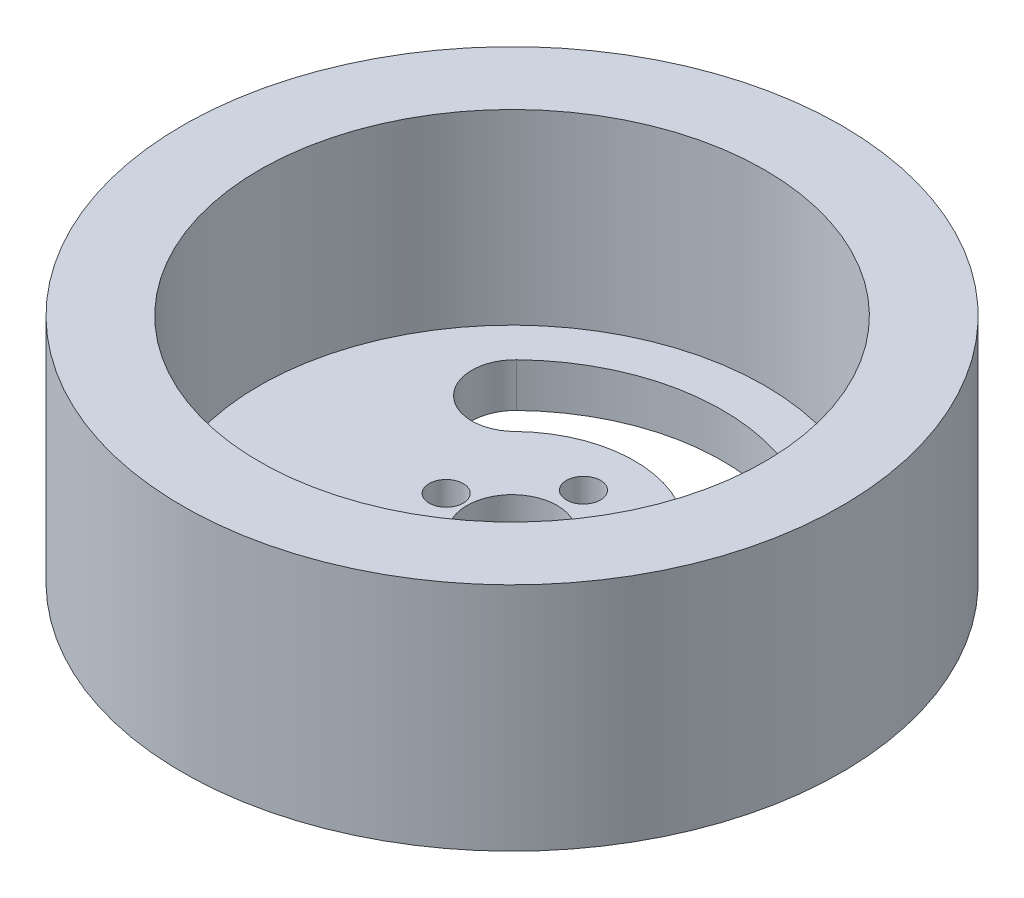
ISO-10303-21;
HEADER;
FILE_DESCRIPTION(('STEP AP214'),'2;1');
FILE_NAME('part.step','',(''),(''),'','','');
FILE_SCHEMA(('AUTOMOTIVE_DESIGN { 1 0 10303 214 1 1 1 1 }'));
ENDSEC;
DATA;
#1=APPLICATION_CONTEXT('core data for automotive mechanical design processes');
#2=APPLICATION_PROTOCOL_DEFINITION('international standard','automotive_design',2000,#1);
#3=PRODUCT_CONTEXT('',#1,'mechanical');
#4=PRODUCT('Part','Part','',(#3));
#5=PRODUCT_RELATED_PRODUCT_CATEGORY('part','',(#4));
#6=PRODUCT_DEFINITION_FORMATION('','',#4);
#7=PRODUCT_DEFINITION_CONTEXT('part definition',#1,'design');
#8=PRODUCT_DEFINITION('design','',#6,#7);
#9=PRODUCT_DEFINITION_SHAPE('','',#8);
#10=(LENGTH_UNIT() NAMED_UNIT(*) SI_UNIT(.MILLI.,.METRE.));
#11=(NAMED_UNIT(*) PLANE_ANGLE_UNIT() SI_UNIT($,.RADIAN.));
#12=(NAMED_UNIT(*) SI_UNIT($,.STERADIAN.) SOLID_ANGLE_UNIT());
#13=UNCERTAINTY_MEASURE_WITH_UNIT(LENGTH_MEASURE(1.E-05),#10,'distance_accuracy_value','');
#14=(GEOMETRIC_REPRESENTATION_CONTEXT(3) GLOBAL_UNCERTAINTY_ASSIGNED_CONTEXT((#13)) GLOBAL_UNIT_ASSIGNED_CONTEXT((#10,
#11,#12)) REPRESENTATION_CONTEXT('',''));
#15=CARTESIAN_POINT('',(0.,0.,0.));
#16=DIRECTION('',(0.,0.,1.));
#17=DIRECTION('',(1.,0.,0.));
#18=AXIS2_PLACEMENT_3D('',#15,#16,#17);
#19=CARTESIAN_POINT('',(0.,21.,0.));
#20=DIRECTION('',(0.,-1.,0.));
#21=DIRECTION('',(0.,0.,-1.));
#22=AXIS2_PLACEMENT_3D('',#19,#20,#21);
#23=CYLINDRICAL_SURFACE('',#22,23.);
#24=CARTESIAN_POINT('',(0.,21.,0.));
#25=DIRECTION('',(0.,1.,0.));
#26=DIRECTION('',(0.,0.,1.));
#27=AXIS2_PLACEMENT_3D('',#24,#25,#26);
#28=CIRCLE('',#27,23.);
#29=CARTESIAN_POINT('',(0.,21.,-23.));
#30=VERTEX_POINT('',#29);
#31=EDGE_CURVE('E178',#30,#30,#28,.T.);
#32=CARTESIAN_POINT('',(0.,4.,0.));
#33=DIRECTION('',(0.,-1.,0.));
#34=DIRECTION('',(0.,0.,-1.));
#35=AXIS2_PLACEMENT_3D('',#32,#33,#34);
#36=CIRCLE('',#35,23.);
#37=CARTESIAN_POINT('',(0.,4.,-23.));
#38=VERTEX_POINT('',#37);
#39=EDGE_CURVE('E169',#38,#38,#36,.T.);
#40=CARTESIAN_POINT('',(0.,21.,-23.));
#41=CARTESIAN_POINT('',(0.,20.8229166666667,-23.));
#42=CARTESIAN_POINT('',(0.,20.6458333333333,-23.));
#43=CARTESIAN_POINT('',(0.,20.2916666666667,-23.));
#44=CARTESIAN_POINT('',(0.,20.1145833333333,-23.));
#45=CARTESIAN_POINT('',(0.,19.7604166666667,-23.));
#46=CARTESIAN_POINT('',(0.,19.5833333333333,-23.));
#47=CARTESIAN_POINT('',(0.,19.2291666666667,-23.));
#48=CARTESIAN_POINT('',(0.,19.0520833333333,-23.));
#49=CARTESIAN_POINT('',(0.,18.6979166666667,-23.));
#50=CARTESIAN_POINT('',(0.,18.5208333333333,-23.));
#51=CARTESIAN_POINT('',(0.,18.1666666666667,-23.));
#52=CARTESIAN_POINT('',(0.,17.9895833333333,-23.));
#53=CARTESIAN_POINT('',(0.,17.6354166666667,-23.));
#54=CARTESIAN_POINT('',(0.,17.4583333333333,-23.));
#55=CARTESIAN_POINT('',(0.,17.1041666666667,-23.));
#56=CARTESIAN_POINT('',(0.,16.9270833333333,-23.));
#57=CARTESIAN_POINT('',(0.,16.5729166666667,-23.));
#58=CARTESIAN_POINT('',(0.,16.3958333333333,-23.));
#59=CARTESIAN_POINT('',(0.,16.0416666666667,-23.));
#60=CARTESIAN_POINT('',(0.,15.8645833333333,-23.));
#61=CARTESIAN_POINT('',(0.,15.5104166666667,-23.));
#62=CARTESIAN_POINT('',(0.,15.3333333333333,-23.));
#63=CARTESIAN_POINT('',(0.,14.9791666666667,-23.));
#64=CARTESIAN_POINT('',(0.,14.8020833333333,-23.));
#65=CARTESIAN_POINT('',(0.,14.4479166666667,-23.));
#66=CARTESIAN_POINT('',(0.,14.2708333333333,-23.));
#67=CARTESIAN_POINT('',(0.,13.9166666666667,-23.));
#68=CARTESIAN_POINT('',(0.,13.7395833333333,-23.));
#69=CARTESIAN_POINT('',(0.,13.3854166666667,-23.));
#70=CARTESIAN_POINT('',(0.,13.2083333333333,-23.));
#71=CARTESIAN_POINT('',(0.,12.8541666666667,-23.));
#72=CARTESIAN_POINT('',(0.,12.6770833333333,-23.));
#73=CARTESIAN_POINT('',(0.,12.3229166666667,-23.));
#74=CARTESIAN_POINT('',(0.,12.1458333333333,-23.));
#75=CARTESIAN_POINT('',(0.,11.7916666666667,-23.));
#76=CARTESIAN_POINT('',(0.,11.6145833333333,-23.));
#77=CARTESIAN_POINT('',(0.,11.2604166666667,-23.));
#78=CARTESIAN_POINT('',(0.,11.0833333333333,-23.));
#79=CARTESIAN_POINT('',(0.,10.7291666666667,-23.));
#80=CARTESIAN_POINT('',(0.,10.5520833333333,-23.));
#81=CARTESIAN_POINT('',(0.,10.1979166666667,-23.));
#82=CARTESIAN_POINT('',(0.,10.0208333333333,-23.));
#83=CARTESIAN_POINT('',(0.,9.66666666666667,-23.));
#84=CARTESIAN_POINT('',(0.,9.48958333333334,-23.));
#85=CARTESIAN_POINT('',(0.,9.13541666666667,-23.));
#86=CARTESIAN_POINT('',(0.,8.95833333333334,-23.));
#87=CARTESIAN_POINT('',(0.,8.60416666666667,-23.));
#88=CARTESIAN_POINT('',(0.,8.42708333333334,-23.));
#89=CARTESIAN_POINT('',(0.,8.07291666666667,-23.));
#90=CARTESIAN_POINT('',(0.,7.89583333333334,-23.));
#91=CARTESIAN_POINT('',(0.,7.54166666666667,-23.));
#92=CARTESIAN_POINT('',(0.,7.36458333333334,-23.));
#93=CARTESIAN_POINT('',(0.,7.01041666666667,-23.));
#94=CARTESIAN_POINT('',(0.,6.83333333333334,-23.));
#95=CARTESIAN_POINT('',(0.,6.47916666666667,-23.));
#96=CARTESIAN_POINT('',(0.,6.30208333333334,-23.));
#97=CARTESIAN_POINT('',(0.,5.94791666666667,-23.));
#98=CARTESIAN_POINT('',(0.,5.77083333333334,-23.));
#99=CARTESIAN_POINT('',(0.,5.41666666666667,-23.));
#100=CARTESIAN_POINT('',(0.,5.23958333333334,-23.));
#101=CARTESIAN_POINT('',(0.,4.88541666666667,-23.));
#102=CARTESIAN_POINT('',(0.,4.70833333333334,-23.));
#103=CARTESIAN_POINT('',(0.,4.35416666666667,-23.));
#104=CARTESIAN_POINT('',(0.,4.17708333333334,-23.));
#105=CARTESIAN_POINT('',(0.,4.,-23.));
#106=B_SPLINE_CURVE_WITH_KNOTS('',3,(#40,#41,#42,#43,#44,#45,#46,#47,#48,#49,#50,#51,#52,#53,
#54,#55,#56,#57,#58,#59,#60,#61,#62,#63,#64,#65,#66,#67,#68,#69,#70,#71,#72,#73,#74,#75,#76,#77,
#78,#79,#80,#81,#82,#83,#84,#85,#86,#87,#88,#89,#90,#91,#92,#93,#94,#95,#96,#97,#98,#99,#100,
#101,#102,#103,#104,#105),.UNSPECIFIED.,.F.,.F.,(4,2,2,2,2,2,2,2,2,2,2,2,2,2,2,2,2,2,2,2,2,2,2,
2,2,2,2,2,2,2,2,2,4),(0.,0.531249999999997,1.0625,1.59375,2.125,2.65625,3.1875,3.71875,4.25,
4.78125,5.3125,5.84375,6.375,6.90625,7.4375,7.96874999999999,8.49999999999999,9.03125,
9.56249999999999,10.09375,10.625,11.15625,11.6875,12.21875,12.75,13.28125,13.8125,14.34375,
14.875,15.40625,15.9375,16.46875,17.),.UNSPECIFIED.);
#107=EDGE_CURVE('BSEAM38',#30,#38,#106,.T.);
#108=ORIENTED_EDGE('',*,*,#31,.T.);
#109=ORIENTED_EDGE('',*,*,#39,.T.);
#110=ORIENTED_EDGE('',*,*,#107,.T.);
#111=ORIENTED_EDGE('',*,*,#107,.F.);
#112=EDGE_LOOP('',(#108,#110,#109,#111));
#113=FACE_BOUND('',#112,.T.);
#114=ADVANCED_FACE('F38',(#113),#23,.F.);
#115=CARTESIAN_POINT('',(0.,21.,0.));
#116=DIRECTION('',(0.,1.,0.));
#117=DIRECTION('',(0.,0.,1.));
#118=AXIS2_PLACEMENT_3D('',#115,#116,#117);
#119=PLANE('',#118);
#120=CARTESIAN_POINT('',(0.,21.,0.));
#121=DIRECTION('',(0.,1.,0.));
#122=DIRECTION('',(0.,0.,1.));
#123=AXIS2_PLACEMENT_3D('',#120,#121,#122);
#124=CIRCLE('',#123,30.);
#125=CARTESIAN_POINT('',(0.,21.,-30.));
#126=VERTEX_POINT('',#125);
#127=EDGE_CURVE('E11',#126,#126,#124,.T.);
#128=ORIENTED_EDGE('',*,*,#127,.T.);
#129=EDGE_LOOP('',(#128));
#130=FACE_BOUND('',#129,.T.);
#131=ORIENTED_EDGE('',*,*,#31,.F.);
#132=EDGE_LOOP('',(#131));
#133=FACE_BOUND('',#132,.T.);
#134=ADVANCED_FACE('F189',(#130,#133),#119,.T.);
#135=CARTESIAN_POINT('',(0.,0.,0.));
#136=DIRECTION('',(0.,1.,0.));
#137=DIRECTION('',(0.,0.,1.));
#138=AXIS2_PLACEMENT_3D('',#135,#136,#137);
#139=PLANE('',#138);
#140=CARTESIAN_POINT('',(0.,0.,0.));
#141=DIRECTION('',(0.,1.,0.));
#142=DIRECTION('',(0.,0.,1.));
#143=AXIS2_PLACEMENT_3D('',#140,#141,#142);
#144=CIRCLE('',#143,30.);
#145=CARTESIAN_POINT('',(0.,0.,-30.));
#146=VERTEX_POINT('',#145);
#147=EDGE_CURVE('E42',#146,#146,#144,.T.);
#148=ORIENTED_EDGE('',*,*,#147,.F.);
#149=EDGE_LOOP('',(#148));
#150=FACE_BOUND('',#149,.T.);
#151=CARTESIAN_POINT('',(0.,0.,-6.5));
#152=DIRECTION('',(0.,-1.,0.));
#153=DIRECTION('',(0.,0.,-1.));
#154=AXIS2_PLACEMENT_3D('',#151,#152,#153);
#155=CIRCLE('',#154,1.55);
#156=CARTESIAN_POINT('',(0.,0.,-8.05));
#157=VERTEX_POINT('',#156);
#158=EDGE_CURVE('E193',#157,#157,#155,.T.);
#159=ORIENTED_EDGE('',*,*,#158,.F.);
#160=EDGE_LOOP('',(#159));
#161=FACE_BOUND('',#160,.T.);
#162=CARTESIAN_POINT('',(0.,0.,6.5));
#163=DIRECTION('',(0.,-1.,0.));
#164=DIRECTION('',(0.,0.,-1.));
#165=AXIS2_PLACEMENT_3D('',#162,#163,#164);
#166=CIRCLE('',#165,1.55);
#167=CARTESIAN_POINT('',(0.,0.,4.95));
#168=VERTEX_POINT('',#167);
#169=EDGE_CURVE('E197',#168,#168,#166,.T.);
#170=ORIENTED_EDGE('',*,*,#169,.F.);
#171=EDGE_LOOP('',(#170));
#172=FACE_BOUND('',#171,.T.);
#173=CARTESIAN_POINT('',(-6.,0.,0.));
#174=DIRECTION('',(0.,-1.,0.));
#175=DIRECTION('',(0.,0.,-1.));
#176=AXIS2_PLACEMENT_3D('',#173,#174,#175);
#177=CIRCLE('',#176,1.55);
#178=CARTESIAN_POINT('',(-6.,0.,-1.55));
#179=VERTEX_POINT('',#178);
#180=EDGE_CURVE('E201',#179,#179,#177,.T.);
#181=ORIENTED_EDGE('',*,*,#180,.F.);
#182=EDGE_LOOP('',(#181));
#183=FACE_BOUND('',#182,.T.);
#184=CARTESIAN_POINT('',(6.,0.,0.));
#185=DIRECTION('',(0.,-1.,0.));
#186=DIRECTION('',(0.,0.,-1.));
#187=AXIS2_PLACEMENT_3D('',#184,#185,#186);
#188=CIRCLE('',#187,1.55);
#189=CARTESIAN_POINT('',(6.,0.,-1.55));
#190=VERTEX_POINT('',#189);
#191=EDGE_CURVE('E205',#190,#190,#188,.T.);
#192=ORIENTED_EDGE('',*,*,#191,.F.);
#193=EDGE_LOOP('',(#192));
#194=FACE_BOUND('',#193,.T.);
#195=CARTESIAN_POINT('',(0.,0.,0.));
#196=DIRECTION('',(0.,-1.,0.));
#197=DIRECTION('',(0.,0.,-1.));
#198=AXIS2_PLACEMENT_3D('',#195,#196,#197);
#199=CIRCLE('',#198,4.1);
#200=CARTESIAN_POINT('',(0.,0.,-4.1));
#201=VERTEX_POINT('',#200);
#202=EDGE_CURVE('E127',#201,#201,#199,.T.);
#203=ORIENTED_EDGE('',*,*,#202,.F.);
#204=EDGE_LOOP('',(#203));
#205=FACE_BOUND('',#204,.T.);
#206=CARTESIAN_POINT('',(10.8727265894757,0.,-10.5407349378886));
#207=DIRECTION('',(0.,-1.,0.));
#208=DIRECTION('',(0.,0.,1.));
#209=AXIS2_PLACEMENT_3D('',#206,#207,#208);
#210=CIRCLE('',#209,4.);
#211=CARTESIAN_POINT('',(13.7446601547108,0.,-13.3249758751776));
#212=VERTEX_POINT('',#211);
#213=CARTESIAN_POINT('',(8.00079302424056,0.,-7.75649400059958));
#214=VERTEX_POINT('',#213);
#215=EDGE_CURVE('E61',#212,#214,#210,.T.);
#216=ORIENTED_EDGE('',*,*,#215,.F.);
#217=CARTESIAN_POINT('',(0.,0.,0.));
#218=DIRECTION('',(0.,-1.,0.));
#219=DIRECTION('',(0.,0.,1.));
#220=AXIS2_PLACEMENT_3D('',#217,#218,#219);
#221=CIRCLE('',#220,19.1434235402803);
#222=CARTESIAN_POINT('',(-13.3249758751776,0.,-13.7446601547108));
#223=VERTEX_POINT('',#222);
#224=EDGE_CURVE('E121',#223,#212,#221,.T.);
#225=ORIENTED_EDGE('',*,*,#224,.F.);
#226=CARTESIAN_POINT('',(-10.5407349378886,0.,-10.8727265894757));
#227=DIRECTION('',(0.,-1.,0.));
#228=DIRECTION('',(0.,0.,1.));
#229=AXIS2_PLACEMENT_3D('',#226,#227,#228);
#230=CIRCLE('',#229,4.);
#231=CARTESIAN_POINT('',(-7.75649400059958,0.,-8.00079302424056));
#232=VERTEX_POINT('',#231);
#233=EDGE_CURVE('E124',#232,#223,#230,.T.);
#234=ORIENTED_EDGE('',*,*,#233,.F.);
#235=CARTESIAN_POINT('',(0.,0.,0.));
#236=DIRECTION('',(0.,1.,0.));
#237=DIRECTION('',(0.,0.,1.));
#238=AXIS2_PLACEMENT_3D('',#235,#236,#237);
#239=CIRCLE('',#238,11.1434235402803);
#240=EDGE_CURVE('E133',#214,#232,#239,.T.);
#241=ORIENTED_EDGE('',*,*,#240,.F.);
#242=EDGE_LOOP('',(#216,#225,#234,#241));
#243=FACE_BOUND('',#242,.T.);
#244=CARTESIAN_POINT('',(10.8727265894757,0.,10.5407349378886));
#245=DIRECTION('',(0.,-1.,0.));
#246=DIRECTION('',(0.,0.,-1.));
#247=AXIS2_PLACEMENT_3D('',#244,#245,#246);
#248=CIRCLE('',#247,4.);
#249=CARTESIAN_POINT('',(8.00079302424056,0.,7.75649400059958));
#250=VERTEX_POINT('',#249);
#251=CARTESIAN_POINT('',(13.7446601547108,0.,13.3249758751776));
#252=VERTEX_POINT('',#251);
#253=EDGE_CURVE('E140',#250,#252,#248,.T.);
#254=ORIENTED_EDGE('',*,*,#253,.F.);
#255=CARTESIAN_POINT('',(0.,0.,0.));
#256=DIRECTION('',(0.,1.,0.));
#257=DIRECTION('',(0.,0.,-1.));
#258=AXIS2_PLACEMENT_3D('',#255,#256,#257);
#259=CIRCLE('',#258,11.1434235402803);
#260=CARTESIAN_POINT('',(-7.75649400059958,0.,8.00079302424056));
#261=VERTEX_POINT('',#260);
#262=EDGE_CURVE('E148',#261,#250,#259,.T.);
#263=ORIENTED_EDGE('',*,*,#262,.F.);
#264=CARTESIAN_POINT('',(-10.5407349378886,0.,10.8727265894757));
#265=DIRECTION('',(0.,-1.,0.));
#266=DIRECTION('',(0.,0.,-1.));
#267=AXIS2_PLACEMENT_3D('',#264,#265,#266);
#268=CIRCLE('',#267,4.);
#269=CARTESIAN_POINT('',(-13.3249758751776,0.,13.7446601547108));
#270=VERTEX_POINT('',#269);
#271=EDGE_CURVE('E162',#270,#261,#268,.T.);
#272=ORIENTED_EDGE('',*,*,#271,.F.);
#273=CARTESIAN_POINT('',(0.,0.,0.));
#274=DIRECTION('',(0.,-1.,0.));
#275=DIRECTION('',(0.,0.,-1.));
#276=AXIS2_PLACEMENT_3D('',#273,#274,#275);
#277=CIRCLE('',#276,19.1434235402803);
#278=EDGE_CURVE('E159',#252,#270,#277,.T.);
#279=ORIENTED_EDGE('',*,*,#278,.F.);
#280=EDGE_LOOP('',(#254,#263,#272,#279));
#281=FACE_BOUND('',#280,.T.);
#282=ADVANCED_FACE('F186',(#150,#161,#172,#183,#194,#205,#243,#281),#139,.F.);
#283=CARTESIAN_POINT('',(0.,21.,0.));
#284=DIRECTION('',(0.,-1.,0.));
#285=DIRECTION('',(0.,0.,-1.));
#286=AXIS2_PLACEMENT_3D('',#283,#284,#285);
#287=CYLINDRICAL_SURFACE('',#286,30.);
#288=CARTESIAN_POINT('',(0.,21.,-30.));
#289=CARTESIAN_POINT('',(0.,20.78125,-30.));
#290=CARTESIAN_POINT('',(0.,20.5625,-30.));
#291=CARTESIAN_POINT('',(0.,20.125,-30.));
#292=CARTESIAN_POINT('',(0.,19.90625,-30.));
#293=CARTESIAN_POINT('',(0.,19.46875,-30.));
#294=CARTESIAN_POINT('',(0.,19.25,-30.));
#295=CARTESIAN_POINT('',(0.,18.8125,-30.));
#296=CARTESIAN_POINT('',(0.,18.59375,-30.));
#297=CARTESIAN_POINT('',(0.,18.15625,-30.));
#298=CARTESIAN_POINT('',(0.,17.9375,-30.));
#299=CARTESIAN_POINT('',(0.,17.5,-30.));
#300=CARTESIAN_POINT('',(0.,17.28125,-30.));
#301=CARTESIAN_POINT('',(0.,16.84375,-30.));
#302=CARTESIAN_POINT('',(0.,16.625,-30.));
#303=CARTESIAN_POINT('',(0.,16.1875,-30.));
#304=CARTESIAN_POINT('',(0.,15.96875,-30.));
#305=CARTESIAN_POINT('',(0.,15.53125,-30.));
#306=CARTESIAN_POINT('',(0.,15.3125,-30.));
#307=CARTESIAN_POINT('',(0.,14.875,-30.));
#308=CARTESIAN_POINT('',(0.,14.65625,-30.));
#309=CARTESIAN_POINT('',(0.,14.21875,-30.));
#310=CARTESIAN_POINT('',(0.,14.,-30.));
#311=CARTESIAN_POINT('',(0.,13.5625,-30.));
#312=CARTESIAN_POINT('',(0.,13.34375,-30.));
#313=CARTESIAN_POINT('',(0.,12.90625,-30.));
#314=CARTESIAN_POINT('',(0.,12.6875,-30.));
#315=CARTESIAN_POINT('',(0.,12.25,-30.));
#316=CARTESIAN_POINT('',(0.,12.03125,-30.));
#317=CARTESIAN_POINT('',(0.,11.59375,-30.));
#318=CARTESIAN_POINT('',(0.,11.375,-30.));
#319=CARTESIAN_POINT('',(0.,10.9375,-30.));
#320=CARTESIAN_POINT('',(0.,10.71875,-30.));
#321=CARTESIAN_POINT('',(0.,10.28125,-30.));
#322=CARTESIAN_POINT('',(0.,10.0625,-30.));
#323=CARTESIAN_POINT('',(0.,9.625,-30.));
#324=CARTESIAN_POINT('',(0.,9.40625,-30.));
#325=CARTESIAN_POINT('',(0.,8.96875,-30.));
#326=CARTESIAN_POINT('',(0.,8.75,-30.));
#327=CARTESIAN_POINT('',(0.,8.3125,-30.));
#328=CARTESIAN_POINT('',(0.,8.09375,-30.));
#329=CARTESIAN_POINT('',(0.,7.65625,-30.));
#330=CARTESIAN_POINT('',(0.,7.4375,-30.));
#331=CARTESIAN_POINT('',(0.,7.,-30.));
#332=CARTESIAN_POINT('',(0.,6.78125,-30.));
#333=CARTESIAN_POINT('',(0.,6.34375,-30.));
#334=CARTESIAN_POINT('',(0.,6.125,-30.));
#335=CARTESIAN_POINT('',(0.,5.6875,-30.));
#336=CARTESIAN_POINT('',(0.,5.46875,-30.));
#337=CARTESIAN_POINT('',(0.,5.03125,-30.));
#338=CARTESIAN_POINT('',(0.,4.8125,-30.));
#339=CARTESIAN_POINT('',(0.,4.375,-30.));
#340=CARTESIAN_POINT('',(0.,4.15625,-30.));
#341=CARTESIAN_POINT('',(0.,3.71875,-30.));
#342=CARTESIAN_POINT('',(0.,3.5,-30.));
#343=CARTESIAN_POINT('',(0.,3.0625,-30.));
#344=CARTESIAN_POINT('',(0.,2.84375,-30.));
#345=CARTESIAN_POINT('',(0.,2.40625,-30.));
#346=CARTESIAN_POINT('',(0.,2.1875,-30.));
#347=CARTESIAN_POINT('',(0.,1.75,-30.));
#348=CARTESIAN_POINT('',(0.,1.53125,-30.));
#349=CARTESIAN_POINT('',(0.,1.09375,-30.));
#350=CARTESIAN_POINT('',(0.,0.875000000000001,-30.));
#351=CARTESIAN_POINT('',(0.,0.4375,-30.));
#352=CARTESIAN_POINT('',(0.,0.21875,-30.));
#353=CARTESIAN_POINT('',(0.,0.,-30.));
#354=B_SPLINE_CURVE_WITH_KNOTS('',3,(#288,#289,#290,#291,#292,#293,#294,#295,#296,#297,#298,
#299,#300,#301,#302,#303,#304,#305,#306,#307,#308,#309,#310,#311,#312,#313,#314,#315,#316,#317,
#318,#319,#320,#321,#322,#323,#324,#325,#326,#327,#328,#329,#330,#331,#332,#333,#334,#335,#336,
#337,#338,#339,#340,#341,#342,#343,#344,#345,#346,#347,#348,#349,#350,#351,#352,#353),
.UNSPECIFIED.,.F.,.F.,(4,2,2,2,2,2,2,2,2,2,2,2,2,2,2,2,2,2,2,2,2,2,2,2,2,2,2,2,2,2,2,2,4),(0.,
0.656249999999997,1.3125,1.96875,2.625,3.28125,3.9375,4.59375,5.25,5.90625,6.5625,7.21875,7.875,
8.53125,9.1875,9.84375,10.5,11.15625,11.8125,12.46875,13.125,13.78125,14.4375,15.09375,15.75,
16.40625,17.0625,17.71875,18.375,19.03125,19.6875,20.34375,21.),.UNSPECIFIED.);
#355=EDGE_CURVE('BSEAM40',#126,#146,#354,.T.);
#356=ORIENTED_EDGE('',*,*,#127,.F.);
#357=ORIENTED_EDGE('',*,*,#147,.T.);
#358=ORIENTED_EDGE('',*,*,#355,.T.);
#359=ORIENTED_EDGE('',*,*,#355,.F.);
#360=EDGE_LOOP('',(#356,#358,#357,#359));
#361=FACE_BOUND('',#360,.T.);
#362=ADVANCED_FACE('F40',(#361),#287,.T.);
#363=CARTESIAN_POINT('',(0.,4.,0.));
#364=DIRECTION('',(0.,-1.,0.));
#365=DIRECTION('',(0.,0.,-1.));
#366=AXIS2_PLACEMENT_3D('',#363,#364,#365);
#367=PLANE('',#366);
#368=CARTESIAN_POINT('',(0.,4.,-6.5));
#369=DIRECTION('',(0.,-1.,0.));
#370=DIRECTION('',(0.,0.,-1.));
#371=AXIS2_PLACEMENT_3D('',#368,#369,#370);
#372=CIRCLE('',#371,1.55);
#373=CARTESIAN_POINT('',(0.,4.,-8.05));
#374=VERTEX_POINT('',#373);
#375=EDGE_CURVE('E360',#374,#374,#372,.T.);
#376=ORIENTED_EDGE('',*,*,#375,.T.);
#377=EDGE_LOOP('',(#376));
#378=FACE_BOUND('',#377,.T.);
#379=CARTESIAN_POINT('',(0.,4.,6.5));
#380=DIRECTION('',(0.,-1.,0.));
#381=DIRECTION('',(0.,0.,-1.));
#382=AXIS2_PLACEMENT_3D('',#379,#380,#381);
#383=CIRCLE('',#382,1.55);
#384=CARTESIAN_POINT('',(0.,4.,4.95));
#385=VERTEX_POINT('',#384);
#386=EDGE_CURVE('E364',#385,#385,#383,.T.);
#387=ORIENTED_EDGE('',*,*,#386,.T.);
#388=EDGE_LOOP('',(#387));
#389=FACE_BOUND('',#388,.T.);
#390=CARTESIAN_POINT('',(-6.,4.,0.));
#391=DIRECTION('',(0.,-1.,0.));
#392=DIRECTION('',(0.,0.,-1.));
#393=AXIS2_PLACEMENT_3D('',#390,#391,#392);
#394=CIRCLE('',#393,1.55);
#395=CARTESIAN_POINT('',(-6.,4.,-1.55));
#396=VERTEX_POINT('',#395);
#397=EDGE_CURVE('E368',#396,#396,#394,.T.);
#398=ORIENTED_EDGE('',*,*,#397,.T.);
#399=EDGE_LOOP('',(#398));
#400=FACE_BOUND('',#399,.T.);
#401=CARTESIAN_POINT('',(6.,4.,0.));
#402=DIRECTION('',(0.,-1.,0.));
#403=DIRECTION('',(0.,0.,-1.));
#404=AXIS2_PLACEMENT_3D('',#401,#402,#403);
#405=CIRCLE('',#404,1.55);
#406=CARTESIAN_POINT('',(6.,4.,-1.55));
#407=VERTEX_POINT('',#406);
#408=EDGE_CURVE('E372',#407,#407,#405,.T.);
#409=ORIENTED_EDGE('',*,*,#408,.T.);
#410=EDGE_LOOP('',(#409));
#411=FACE_BOUND('',#410,.T.);
#412=CARTESIAN_POINT('',(0.,4.,0.));
#413=DIRECTION('',(0.,-1.,0.));
#414=DIRECTION('',(0.,0.,-1.));
#415=AXIS2_PLACEMENT_3D('',#412,#413,#414);
#416=CIRCLE('',#415,4.1);
#417=CARTESIAN_POINT('',(0.,4.,-4.1));
#418=VERTEX_POINT('',#417);
#419=EDGE_CURVE('E134',#418,#418,#416,.T.);
#420=ORIENTED_EDGE('',*,*,#419,.T.);
#421=EDGE_LOOP('',(#420));
#422=FACE_BOUND('',#421,.T.);
#423=CARTESIAN_POINT('',(0.,4.,0.));
#424=DIRECTION('',(0.,-1.,0.));
#425=DIRECTION('',(0.,0.,1.));
#426=AXIS2_PLACEMENT_3D('',#423,#424,#425);
#427=CIRCLE('',#426,19.1434235402803);
#428=CARTESIAN_POINT('',(-13.3249758751776,4.,-13.7446601547108));
#429=VERTEX_POINT('',#428);
#430=CARTESIAN_POINT('',(13.7446601547108,4.,-13.3249758751776));
#431=VERTEX_POINT('',#430);
#432=EDGE_CURVE('E111',#429,#431,#427,.T.);
#433=ORIENTED_EDGE('',*,*,#432,.T.);
#434=CARTESIAN_POINT('',(10.8727265894757,4.,-10.5407349378886));
#435=DIRECTION('',(0.,-1.,0.));
#436=DIRECTION('',(0.,0.,1.));
#437=AXIS2_PLACEMENT_3D('',#434,#435,#436);
#438=CIRCLE('',#437,4.);
#439=CARTESIAN_POINT('',(8.00079302424056,4.,-7.75649400059958));
#440=VERTEX_POINT('',#439);
#441=EDGE_CURVE('E105',#431,#440,#438,.T.);
#442=ORIENTED_EDGE('',*,*,#441,.T.);
#443=CARTESIAN_POINT('',(0.,4.,0.));
#444=DIRECTION('',(0.,1.,0.));
#445=DIRECTION('',(0.,0.,1.));
#446=AXIS2_PLACEMENT_3D('',#443,#444,#445);
#447=CIRCLE('',#446,11.1434235402803);
#448=CARTESIAN_POINT('',(-7.75649400059958,4.,-8.00079302424056));
#449=VERTEX_POINT('',#448);
#450=EDGE_CURVE('E114',#440,#449,#447,.T.);
#451=ORIENTED_EDGE('',*,*,#450,.T.);
#452=CARTESIAN_POINT('',(-10.5407349378886,4.,-10.8727265894757));
#453=DIRECTION('',(0.,-1.,0.));
#454=DIRECTION('',(0.,0.,1.));
#455=AXIS2_PLACEMENT_3D('',#452,#453,#454);
#456=CIRCLE('',#455,4.);
#457=EDGE_CURVE('E53',#449,#429,#456,.T.);
#458=ORIENTED_EDGE('',*,*,#457,.T.);
#459=EDGE_LOOP('',(#433,#442,#451,#458));
#460=FACE_BOUND('',#459,.T.);
#461=CARTESIAN_POINT('',(0.,4.,0.));
#462=DIRECTION('',(0.,1.,0.));
#463=DIRECTION('',(0.,0.,-1.));
#464=AXIS2_PLACEMENT_3D('',#461,#462,#463);
#465=CIRCLE('',#464,11.1434235402803);
#466=CARTESIAN_POINT('',(-7.75649400059958,4.,8.00079302424056));
#467=VERTEX_POINT('',#466);
#468=CARTESIAN_POINT('',(8.00079302424056,4.,7.75649400059958));
#469=VERTEX_POINT('',#468);
#470=EDGE_CURVE('E154',#467,#469,#465,.T.);
#471=ORIENTED_EDGE('',*,*,#470,.T.);
#472=CARTESIAN_POINT('',(10.8727265894757,4.,10.5407349378886));
#473=DIRECTION('',(0.,-1.,0.));
#474=DIRECTION('',(0.,0.,-1.));
#475=AXIS2_PLACEMENT_3D('',#472,#473,#474);
#476=CIRCLE('',#475,4.);
#477=CARTESIAN_POINT('',(13.7446601547108,4.,13.3249758751776));
#478=VERTEX_POINT('',#477);
#479=EDGE_CURVE('E144',#469,#478,#476,.T.);
#480=ORIENTED_EDGE('',*,*,#479,.T.);
#481=CARTESIAN_POINT('',(0.,4.,0.));
#482=DIRECTION('',(0.,-1.,0.));
#483=DIRECTION('',(0.,0.,-1.));
#484=AXIS2_PLACEMENT_3D('',#481,#482,#483);
#485=CIRCLE('',#484,19.1434235402803);
#486=CARTESIAN_POINT('',(-13.3249758751776,4.,13.7446601547108));
#487=VERTEX_POINT('',#486);
#488=EDGE_CURVE('E147',#478,#487,#485,.T.);
#489=ORIENTED_EDGE('',*,*,#488,.T.);
#490=CARTESIAN_POINT('',(-10.5407349378886,4.,10.8727265894757));
#491=DIRECTION('',(0.,-1.,0.));
#492=DIRECTION('',(0.,0.,-1.));
#493=AXIS2_PLACEMENT_3D('',#490,#491,#492);
#494=CIRCLE('',#493,4.);
#495=EDGE_CURVE('E151',#487,#467,#494,.T.);
#496=ORIENTED_EDGE('',*,*,#495,.T.);
#497=EDGE_LOOP('',(#471,#480,#489,#496));
#498=FACE_BOUND('',#497,.T.);
#499=ORIENTED_EDGE('',*,*,#39,.F.);
#500=EDGE_LOOP('',(#499));
#501=FACE_BOUND('',#500,.T.);
#502=ADVANCED_FACE('F118',(#378,#389,#400,#411,#422,#460,#498,#501),#367,.F.);
#503=CARTESIAN_POINT('',(10.8727265894757,4.,10.5407349378886));
#504=DIRECTION('',(0.,-1.,0.));
#505=DIRECTION('',(0.,0.,-1.));
#506=AXIS2_PLACEMENT_3D('',#503,#504,#505);
#507=CYLINDRICAL_SURFACE('',#506,4.);
#508=ORIENTED_EDGE('',*,*,#253,.T.);
#509=DIRECTION('',(0.,-1.,0.));
#510=VECTOR('',#509,1.);
#511=CARTESIAN_POINT('',(13.7446601547108,4.,13.3249758751776));
#512=LINE('',#511,#510);
#513=EDGE_CURVE('E157',#478,#252,#512,.T.);
#514=ORIENTED_EDGE('',*,*,#513,.F.);
#515=ORIENTED_EDGE('',*,*,#479,.F.);
#516=DIRECTION('',(0.,-1.,0.));
#517=VECTOR('',#516,1.);
#518=CARTESIAN_POINT('',(8.00079302424056,4.,7.75649400059958));
#519=LINE('',#518,#517);
#520=EDGE_CURVE('E167',#469,#250,#519,.T.);
#521=ORIENTED_EDGE('',*,*,#520,.T.);
#522=EDGE_LOOP('',(#508,#514,#515,#521));
#523=FACE_BOUND('',#522,.T.);
#524=ADVANCED_FACE('F216',(#523),#507,.F.);
#525=CARTESIAN_POINT('',(0.,4.,0.));
#526=DIRECTION('',(0.,-1.,0.));
#527=DIRECTION('',(0.,0.,-1.));
#528=AXIS2_PLACEMENT_3D('',#525,#526,#527);
#529=CYLINDRICAL_SURFACE('',#528,11.1434235402803);
#530=ORIENTED_EDGE('',*,*,#262,.T.);
#531=ORIENTED_EDGE('',*,*,#520,.F.);
#532=ORIENTED_EDGE('',*,*,#470,.F.);
#533=DIRECTION('',(0.,-1.,0.));
#534=VECTOR('',#533,1.);
#535=CARTESIAN_POINT('',(-7.75649400059958,4.,8.00079302424056));
#536=LINE('',#535,#534);
#537=EDGE_CURVE('E170',#467,#261,#536,.T.);
#538=ORIENTED_EDGE('',*,*,#537,.T.);
#539=EDGE_LOOP('',(#530,#531,#532,#538));
#540=FACE_BOUND('',#539,.T.);
#541=ADVANCED_FACE('F225',(#540),#529,.T.);
#542=CARTESIAN_POINT('',(-10.5407349378886,4.,10.8727265894757));
#543=DIRECTION('',(0.,-1.,0.));
#544=DIRECTION('',(0.,0.,-1.));
#545=AXIS2_PLACEMENT_3D('',#542,#543,#544);
#546=CYLINDRICAL_SURFACE('',#545,4.);
#547=ORIENTED_EDGE('',*,*,#271,.T.);
#548=ORIENTED_EDGE('',*,*,#537,.F.);
#549=ORIENTED_EDGE('',*,*,#495,.F.);
#550=DIRECTION('',(0.,-1.,0.));
#551=VECTOR('',#550,1.);
#552=CARTESIAN_POINT('',(-13.3249758751776,4.,13.7446601547108));
#553=LINE('',#552,#551);
#554=EDGE_CURVE('E172',#487,#270,#553,.T.);
#555=ORIENTED_EDGE('',*,*,#554,.T.);
#556=EDGE_LOOP('',(#547,#548,#549,#555));
#557=FACE_BOUND('',#556,.T.);
#558=ADVANCED_FACE('F227',(#557),#546,.F.);
#559=CARTESIAN_POINT('',(0.,4.,0.));
#560=DIRECTION('',(0.,-1.,0.));
#561=DIRECTION('',(0.,0.,-1.));
#562=AXIS2_PLACEMENT_3D('',#559,#560,#561);
#563=CYLINDRICAL_SURFACE('',#562,19.1434235402803);
#564=ORIENTED_EDGE('',*,*,#278,.T.);
#565=ORIENTED_EDGE('',*,*,#554,.F.);
#566=ORIENTED_EDGE('',*,*,#488,.F.);
#567=ORIENTED_EDGE('',*,*,#513,.T.);
#568=EDGE_LOOP('',(#564,#565,#566,#567));
#569=FACE_BOUND('',#568,.T.);
#570=ADVANCED_FACE('F220',(#569),#563,.F.);
#571=CARTESIAN_POINT('',(10.8727265894757,4.,-10.5407349378886));
#572=DIRECTION('',(0.,-1.,0.));
#573=DIRECTION('',(0.,0.,-1.));
#574=AXIS2_PLACEMENT_3D('',#571,#572,#573);
#575=CYLINDRICAL_SURFACE('',#574,4.);
#576=ORIENTED_EDGE('',*,*,#215,.T.);
#577=DIRECTION('',(0.,-1.,0.));
#578=VECTOR('',#577,1.);
#579=CARTESIAN_POINT('',(8.00079302424056,4.,-7.75649400059958));
#580=LINE('',#579,#578);
#581=EDGE_CURVE('E101',#440,#214,#580,.T.);
#582=ORIENTED_EDGE('',*,*,#581,.F.);
#583=ORIENTED_EDGE('',*,*,#441,.F.);
#584=DIRECTION('',(0.,-1.,0.));
#585=VECTOR('',#584,1.);
#586=CARTESIAN_POINT('',(13.7446601547108,4.,-13.3249758751776));
#587=LINE('',#586,#585);
#588=EDGE_CURVE('E138',#431,#212,#587,.T.);
#589=ORIENTED_EDGE('',*,*,#588,.T.);
#590=EDGE_LOOP('',(#576,#582,#583,#589));
#591=FACE_BOUND('',#590,.T.);
#592=ADVANCED_FACE('F103',(#591),#575,.F.);
#593=CARTESIAN_POINT('',(0.,4.,0.));
#594=DIRECTION('',(0.,-1.,0.));
#595=DIRECTION('',(0.,0.,-1.));
#596=AXIS2_PLACEMENT_3D('',#593,#594,#595);
#597=CYLINDRICAL_SURFACE('',#596,19.1434235402803);
#598=ORIENTED_EDGE('',*,*,#224,.T.);
#599=ORIENTED_EDGE('',*,*,#588,.F.);
#600=ORIENTED_EDGE('',*,*,#432,.F.);
#601=DIRECTION('',(0.,-1.,0.));
#602=VECTOR('',#601,1.);
#603=CARTESIAN_POINT('',(-13.3249758751776,4.,-13.7446601547108));
#604=LINE('',#603,#602);
#605=EDGE_CURVE('E141',#429,#223,#604,.T.);
#606=ORIENTED_EDGE('',*,*,#605,.T.);
#607=EDGE_LOOP('',(#598,#599,#600,#606));
#608=FACE_BOUND('',#607,.T.);
#609=ADVANCED_FACE('F277',(#608),#597,.F.);
#610=CARTESIAN_POINT('',(-10.5407349378886,4.,-10.8727265894757));
#611=DIRECTION('',(0.,-1.,0.));
#612=DIRECTION('',(0.,0.,-1.));
#613=AXIS2_PLACEMENT_3D('',#610,#611,#612);
#614=CYLINDRICAL_SURFACE('',#613,4.);
#615=ORIENTED_EDGE('',*,*,#233,.T.);
#616=ORIENTED_EDGE('',*,*,#605,.F.);
#617=ORIENTED_EDGE('',*,*,#457,.F.);
#618=DIRECTION('',(0.,-1.,0.));
#619=VECTOR('',#618,1.);
#620=CARTESIAN_POINT('',(-7.75649400059958,4.,-8.00079302424056));
#621=LINE('',#620,#619);
#622=EDGE_CURVE('E110',#449,#232,#621,.T.);
#623=ORIENTED_EDGE('',*,*,#622,.T.);
#624=EDGE_LOOP('',(#615,#616,#617,#623));
#625=FACE_BOUND('',#624,.T.);
#626=ADVANCED_FACE('F286',(#625),#614,.F.);
#627=CARTESIAN_POINT('',(0.,4.,0.));
#628=DIRECTION('',(0.,-1.,0.));
#629=DIRECTION('',(0.,0.,-1.));
#630=AXIS2_PLACEMENT_3D('',#627,#628,#629);
#631=CYLINDRICAL_SURFACE('',#630,11.1434235402803);
#632=ORIENTED_EDGE('',*,*,#240,.T.);
#633=ORIENTED_EDGE('',*,*,#622,.F.);
#634=ORIENTED_EDGE('',*,*,#450,.F.);
#635=ORIENTED_EDGE('',*,*,#581,.T.);
#636=EDGE_LOOP('',(#632,#633,#634,#635));
#637=FACE_BOUND('',#636,.T.);
#638=ADVANCED_FACE('F115',(#637),#631,.T.);
#639=CARTESIAN_POINT('',(0.,4.,0.));
#640=DIRECTION('',(0.,-1.,0.));
#641=DIRECTION('',(0.,0.,-1.));
#642=AXIS2_PLACEMENT_3D('',#639,#640,#641);
#643=CYLINDRICAL_SURFACE('',#642,4.1);
#644=ORIENTED_EDGE('',*,*,#419,.F.);
#645=EDGE_LOOP('',(#644));
#646=FACE_BOUND('',#645,.T.);
#647=ORIENTED_EDGE('',*,*,#202,.T.);
#648=EDGE_LOOP('',(#647));
#649=FACE_BOUND('',#648,.T.);
#650=ADVANCED_FACE('F304',(#646,#649),#643,.F.);
#651=CARTESIAN_POINT('',(6.,4.,0.));
#652=DIRECTION('',(0.,-1.,0.));
#653=DIRECTION('',(0.,0.,-1.));
#654=AXIS2_PLACEMENT_3D('',#651,#652,#653);
#655=CYLINDRICAL_SURFACE('',#654,1.55);
#656=ORIENTED_EDGE('',*,*,#408,.F.);
#657=EDGE_LOOP('',(#656));
#658=FACE_BOUND('',#657,.T.);
#659=ORIENTED_EDGE('',*,*,#191,.T.);
#660=EDGE_LOOP('',(#659));
#661=FACE_BOUND('',#660,.T.);
#662=ADVANCED_FACE('F313',(#658,#661),#655,.F.);
#663=CARTESIAN_POINT('',(-6.,4.,0.));
#664=DIRECTION('',(0.,-1.,0.));
#665=DIRECTION('',(0.,0.,-1.));
#666=AXIS2_PLACEMENT_3D('',#663,#664,#665);
#667=CYLINDRICAL_SURFACE('',#666,1.55);
#668=ORIENTED_EDGE('',*,*,#397,.F.);
#669=EDGE_LOOP('',(#668));
#670=FACE_BOUND('',#669,.T.);
#671=ORIENTED_EDGE('',*,*,#180,.T.);
#672=EDGE_LOOP('',(#671));
#673=FACE_BOUND('',#672,.T.);
#674=ADVANCED_FACE('F323',(#670,#673),#667,.F.);
#675=CARTESIAN_POINT('',(0.,4.,6.5));
#676=DIRECTION('',(0.,-1.,0.));
#677=DIRECTION('',(0.,0.,-1.));
#678=AXIS2_PLACEMENT_3D('',#675,#676,#677);
#679=CYLINDRICAL_SURFACE('',#678,1.55);
#680=ORIENTED_EDGE('',*,*,#386,.F.);
#681=EDGE_LOOP('',(#680));
#682=FACE_BOUND('',#681,.T.);
#683=ORIENTED_EDGE('',*,*,#169,.T.);
#684=EDGE_LOOP('',(#683));
#685=FACE_BOUND('',#684,.T.);
#686=ADVANCED_FACE('F333',(#682,#685),#679,.F.);
#687=CARTESIAN_POINT('',(0.,4.,-6.5));
#688=DIRECTION('',(0.,-1.,0.));
#689=DIRECTION('',(0.,0.,-1.));
#690=AXIS2_PLACEMENT_3D('',#687,#688,#689);
#691=CYLINDRICAL_SURFACE('',#690,1.55);
#692=ORIENTED_EDGE('',*,*,#375,.F.);
#693=EDGE_LOOP('',(#692));
#694=FACE_BOUND('',#693,.T.);
#695=ORIENTED_EDGE('',*,*,#158,.T.);
#696=EDGE_LOOP('',(#695));
#697=FACE_BOUND('',#696,.T.);
#698=ADVANCED_FACE('F343',(#694,#697),#691,.F.);
#699=CLOSED_SHELL('',(#114,#134,#282,#362,#502,#524,#541,#558,#570,#592,#609,#626,#638,#650,
#662,#674,#686,#698));
#700=MANIFOLD_SOLID_BREP('B2',#699);
#701=ADVANCED_BREP_SHAPE_REPRESENTATION('',(#18,#700),#14);
#702=SHAPE_DEFINITION_REPRESENTATION(#9,#701);
ENDSEC;
END-ISO-10303-21;
